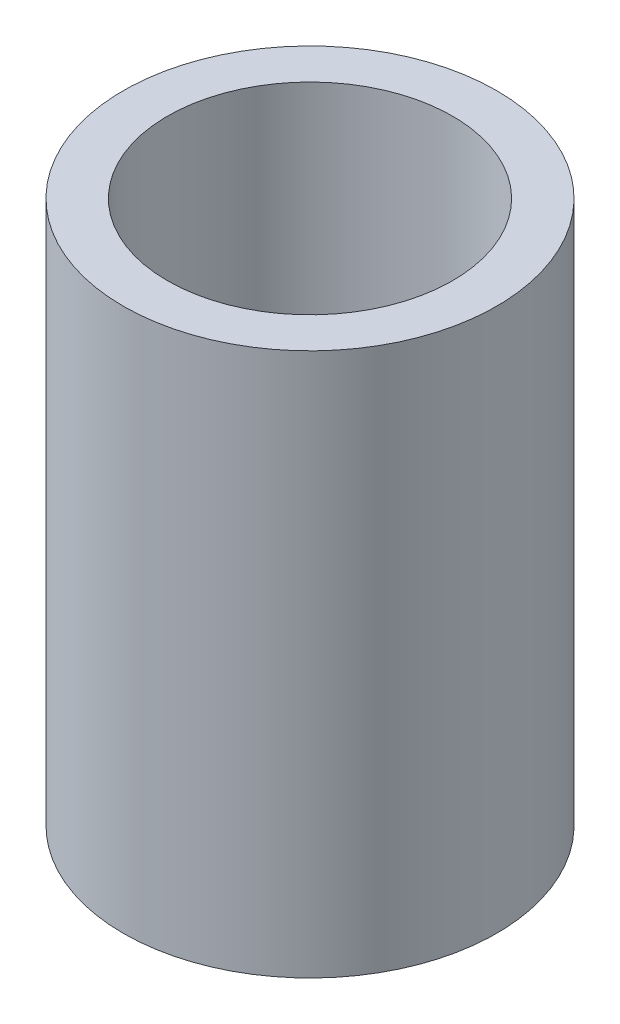
ISO-10303-21;
HEADER;
FILE_DESCRIPTION(('STEP AP214'),'2;1');
FILE_NAME('part.step','',(''),(''),'','','');
FILE_SCHEMA(('AUTOMOTIVE_DESIGN { 1 0 10303 214 1 1 1 1 }'));
ENDSEC;
DATA;
#1=APPLICATION_CONTEXT('core data for automotive mechanical design processes');
#2=APPLICATION_PROTOCOL_DEFINITION('international standard','automotive_design',2000,#1);
#3=PRODUCT_CONTEXT('',#1,'mechanical');
#4=PRODUCT('Part','Part','',(#3));
#5=PRODUCT_RELATED_PRODUCT_CATEGORY('part','',(#4));
#6=PRODUCT_DEFINITION_FORMATION('','',#4);
#7=PRODUCT_DEFINITION_CONTEXT('part definition',#1,'design');
#8=PRODUCT_DEFINITION('design','',#6,#7);
#9=PRODUCT_DEFINITION_SHAPE('','',#8);
#10=(LENGTH_UNIT() NAMED_UNIT(*) SI_UNIT(.MILLI.,.METRE.));
#11=(NAMED_UNIT(*) PLANE_ANGLE_UNIT() SI_UNIT($,.RADIAN.));
#12=(NAMED_UNIT(*) SI_UNIT($,.STERADIAN.) SOLID_ANGLE_UNIT());
#13=UNCERTAINTY_MEASURE_WITH_UNIT(LENGTH_MEASURE(1.E-05),#10,'distance_accuracy_value','');
#14=(GEOMETRIC_REPRESENTATION_CONTEXT(3) GLOBAL_UNCERTAINTY_ASSIGNED_CONTEXT((#13)) GLOBAL_UNIT_ASSIGNED_CONTEXT((#10,
#11,#12)) REPRESENTATION_CONTEXT('',''));
#15=CARTESIAN_POINT('',(0.,0.,0.));
#16=DIRECTION('',(0.,0.,1.));
#17=DIRECTION('',(1.,0.,0.));
#18=AXIS2_PLACEMENT_3D('',#15,#16,#17);
#19=CARTESIAN_POINT('',(0.,16.,0.));
#20=DIRECTION('',(0.,1.,0.));
#21=DIRECTION('',(0.,0.,1.));
#22=AXIS2_PLACEMENT_3D('',#19,#20,#21);
#23=PLANE('',#22);
#24=CARTESIAN_POINT('',(0.,16.,0.));
#25=DIRECTION('',(0.,1.,0.));
#26=DIRECTION('',(0.,0.,1.));
#27=AXIS2_PLACEMENT_3D('',#24,#25,#26);
#28=CIRCLE('',#27,5.5);
#29=CARTESIAN_POINT('',(0.,16.,5.5));
#30=VERTEX_POINT('',#29);
#31=EDGE_CURVE('E10',#30,#30,#28,.T.);
#32=ORIENTED_EDGE('',*,*,#31,.T.);
#33=EDGE_LOOP('',(#32));
#34=FACE_BOUND('',#33,.T.);
#35=CARTESIAN_POINT('',(0.,16.,0.));
#36=DIRECTION('',(0.,1.,0.));
#37=DIRECTION('',(0.,0.,1.));
#38=AXIS2_PLACEMENT_3D('',#35,#36,#37);
#39=CIRCLE('',#38,4.2);
#40=CARTESIAN_POINT('',(0.,16.,4.2));
#41=VERTEX_POINT('',#40);
#42=EDGE_CURVE('E42',#41,#41,#39,.T.);
#43=ORIENTED_EDGE('',*,*,#42,.F.);
#44=EDGE_LOOP('',(#43));
#45=FACE_BOUND('',#44,.T.);
#46=ADVANCED_FACE('F31',(#34,#45),#23,.T.);
#47=CARTESIAN_POINT('',(0.,0.,0.));
#48=DIRECTION('',(0.,1.,0.));
#49=DIRECTION('',(0.,0.,1.));
#50=AXIS2_PLACEMENT_3D('',#47,#48,#49);
#51=PLANE('',#50);
#52=CARTESIAN_POINT('',(0.,0.,0.));
#53=DIRECTION('',(0.,1.,0.));
#54=DIRECTION('',(0.,0.,1.));
#55=AXIS2_PLACEMENT_3D('',#52,#53,#54);
#56=CIRCLE('',#55,5.5);
#57=CARTESIAN_POINT('',(0.,0.,5.5));
#58=VERTEX_POINT('',#57);
#59=EDGE_CURVE('E35',#58,#58,#56,.T.);
#60=ORIENTED_EDGE('',*,*,#59,.F.);
#61=EDGE_LOOP('',(#60));
#62=FACE_BOUND('',#61,.T.);
#63=CARTESIAN_POINT('',(0.,0.,0.));
#64=DIRECTION('',(0.,1.,0.));
#65=DIRECTION('',(0.,0.,1.));
#66=AXIS2_PLACEMENT_3D('',#63,#64,#65);
#67=CIRCLE('',#66,4.2);
#68=CARTESIAN_POINT('',(0.,0.,4.2));
#69=VERTEX_POINT('',#68);
#70=EDGE_CURVE('E44',#69,#69,#67,.T.);
#71=ORIENTED_EDGE('',*,*,#70,.T.);
#72=EDGE_LOOP('',(#71));
#73=FACE_BOUND('',#72,.T.);
#74=ADVANCED_FACE('F54',(#62,#73),#51,.F.);
#75=CARTESIAN_POINT('',(0.,16.,0.));
#76=DIRECTION('',(0.,-1.,0.));
#77=DIRECTION('',(0.,0.,-1.));
#78=AXIS2_PLACEMENT_3D('',#75,#76,#77);
#79=CYLINDRICAL_SURFACE('',#78,5.5);
#80=ORIENTED_EDGE('',*,*,#31,.F.);
#81=EDGE_LOOP('',(#80));
#82=FACE_BOUND('',#81,.T.);
#83=ORIENTED_EDGE('',*,*,#59,.T.);
#84=EDGE_LOOP('',(#83));
#85=FACE_BOUND('',#84,.T.);
#86=ADVANCED_FACE('F33',(#82,#85),#79,.T.);
#87=CARTESIAN_POINT('',(0.,16.,0.));
#88=DIRECTION('',(0.,-1.,0.));
#89=DIRECTION('',(0.,0.,-1.));
#90=AXIS2_PLACEMENT_3D('',#87,#88,#89);
#91=CYLINDRICAL_SURFACE('',#90,4.2);
#92=ORIENTED_EDGE('',*,*,#42,.T.);
#93=EDGE_LOOP('',(#92));
#94=FACE_BOUND('',#93,.T.);
#95=ORIENTED_EDGE('',*,*,#70,.F.);
#96=EDGE_LOOP('',(#95));
#97=FACE_BOUND('',#96,.T.);
#98=ADVANCED_FACE('F50',(#94,#97),#91,.F.);
#99=CLOSED_SHELL('',(#46,#74,#86,#98));
#100=MANIFOLD_SOLID_BREP('B2',#99);
#101=ADVANCED_BREP_SHAPE_REPRESENTATION('',(#18,#100),#14);
#102=SHAPE_DEFINITION_REPRESENTATION(#9,#101);
ENDSEC;
END-ISO-10303-21;
